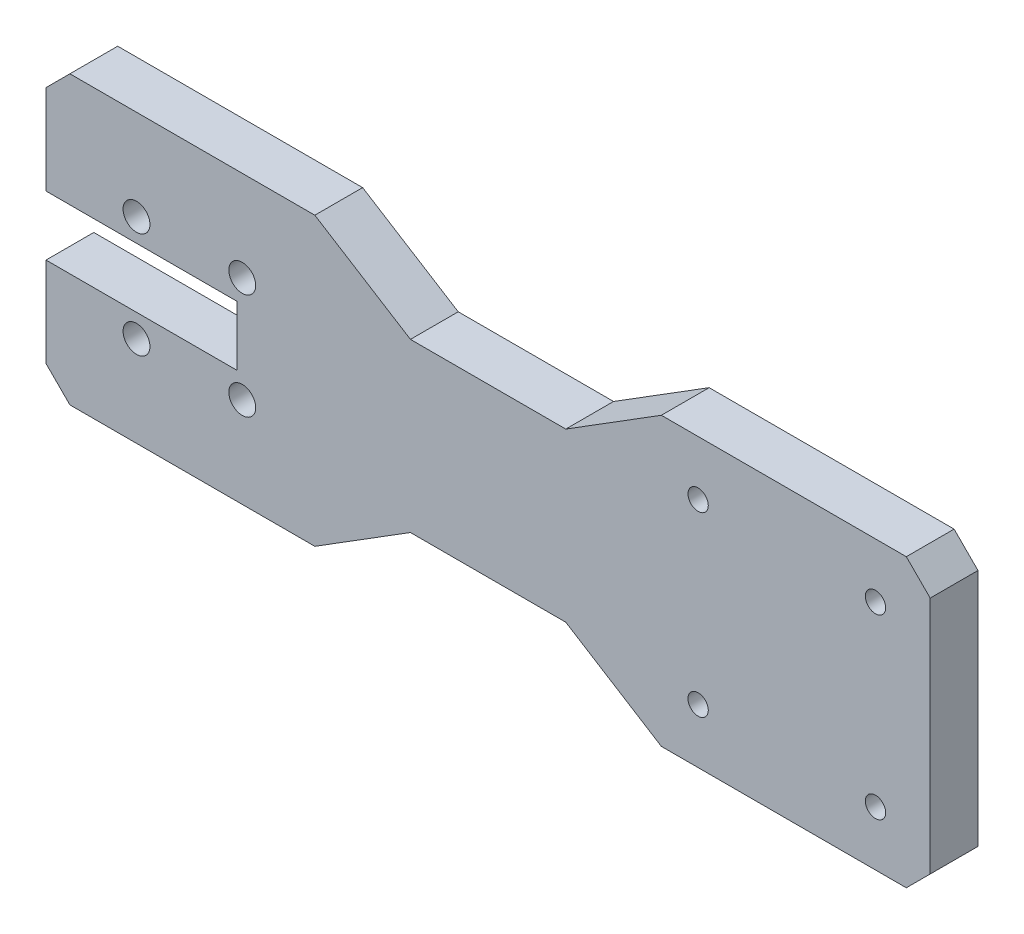
ISO-10303-21;
HEADER;
FILE_DESCRIPTION(('STEP AP214'),'2;1');
FILE_NAME('part.step','',(''),(''),'','','');
FILE_SCHEMA(('AUTOMOTIVE_DESIGN { 1 0 10303 214 1 1 1 1 }'));
ENDSEC;
DATA;
#1=APPLICATION_CONTEXT('core data for automotive mechanical design processes');
#2=APPLICATION_PROTOCOL_DEFINITION('international standard','automotive_design',2000,#1);
#3=PRODUCT_CONTEXT('',#1,'mechanical');
#4=PRODUCT('Part','Part','',(#3));
#5=PRODUCT_RELATED_PRODUCT_CATEGORY('part','',(#4));
#6=PRODUCT_DEFINITION_FORMATION('','',#4);
#7=PRODUCT_DEFINITION_CONTEXT('part definition',#1,'design');
#8=PRODUCT_DEFINITION('design','',#6,#7);
#9=PRODUCT_DEFINITION_SHAPE('','',#8);
#10=(LENGTH_UNIT() NAMED_UNIT(*) SI_UNIT(.MILLI.,.METRE.));
#11=(NAMED_UNIT(*) PLANE_ANGLE_UNIT() SI_UNIT($,.RADIAN.));
#12=(NAMED_UNIT(*) SI_UNIT($,.STERADIAN.) SOLID_ANGLE_UNIT());
#13=UNCERTAINTY_MEASURE_WITH_UNIT(LENGTH_MEASURE(1.E-05),#10,'distance_accuracy_value','');
#14=(GEOMETRIC_REPRESENTATION_CONTEXT(3) GLOBAL_UNCERTAINTY_ASSIGNED_CONTEXT((#13)) GLOBAL_UNIT_ASSIGNED_CONTEXT((#10,
#11,#12)) REPRESENTATION_CONTEXT('',''));
#15=CARTESIAN_POINT('',(0.,0.,0.));
#16=DIRECTION('',(0.,0.,1.));
#17=DIRECTION('',(1.,0.,0.));
#18=AXIS2_PLACEMENT_3D('',#15,#16,#17);
#19=CARTESIAN_POINT('',(0.,0.,8.));
#20=DIRECTION('',(0.,0.,1.));
#21=DIRECTION('',(1.,0.,0.));
#22=AXIS2_PLACEMENT_3D('',#19,#20,#21);
#23=PLANE('',#22);
#24=CARTESIAN_POINT('',(114.845,-14.845,8.));
#25=DIRECTION('',(0.,0.,1.));
#26=DIRECTION('',(1.,0.,0.));
#27=AXIS2_PLACEMENT_3D('',#24,#25,#26);
#28=CIRCLE('',#27,1.69999999999999);
#29=CARTESIAN_POINT('',(116.545,-14.845,8.));
#30=VERTEX_POINT('',#29);
#31=EDGE_CURVE('E415',#30,#30,#28,.T.);
#32=ORIENTED_EDGE('',*,*,#31,.F.);
#33=EDGE_LOOP('',(#32));
#34=FACE_BOUND('',#33,.T.);
#35=CARTESIAN_POINT('',(85.155,-14.845,8.));
#36=DIRECTION('',(0.,0.,1.));
#37=DIRECTION('',(1.,0.,0.));
#38=AXIS2_PLACEMENT_3D('',#35,#36,#37);
#39=CIRCLE('',#38,1.69999999999999);
#40=CARTESIAN_POINT('',(86.855,-14.845,8.));
#41=VERTEX_POINT('',#40);
#42=EDGE_CURVE('E427',#41,#41,#39,.T.);
#43=ORIENTED_EDGE('',*,*,#42,.F.);
#44=EDGE_LOOP('',(#43));
#45=FACE_BOUND('',#44,.T.);
#46=CARTESIAN_POINT('',(8.85,-8.85,8.));
#47=DIRECTION('',(0.,0.,1.));
#48=DIRECTION('',(1.,0.,0.));
#49=AXIS2_PLACEMENT_3D('',#46,#47,#48);
#50=CIRCLE('',#49,2.25);
#51=CARTESIAN_POINT('',(11.1,-8.85,8.));
#52=VERTEX_POINT('',#51);
#53=EDGE_CURVE('E439',#52,#52,#50,.T.);
#54=ORIENTED_EDGE('',*,*,#53,.F.);
#55=EDGE_LOOP('',(#54));
#56=FACE_BOUND('',#55,.T.);
#57=CARTESIAN_POINT('',(-8.85,-8.85,8.));
#58=DIRECTION('',(0.,0.,1.));
#59=DIRECTION('',(1.,0.,0.));
#60=AXIS2_PLACEMENT_3D('',#57,#58,#59);
#61=CIRCLE('',#60,2.25);
#62=CARTESIAN_POINT('',(-6.6,-8.85,8.));
#63=VERTEX_POINT('',#62);
#64=EDGE_CURVE('E210',#63,#63,#61,.T.);
#65=ORIENTED_EDGE('',*,*,#64,.F.);
#66=EDGE_LOOP('',(#65));
#67=FACE_BOUND('',#66,.T.);
#68=DIRECTION('',(0.,-1.,0.));
#69=VECTOR('',#68,1.);
#70=CARTESIAN_POINT('',(-24.,-5.,8.));
#71=LINE('',#70,#69);
#72=CARTESIAN_POINT('',(-24.,-5.,8.));
#73=VERTEX_POINT('',#72);
#74=CARTESIAN_POINT('',(-24.,-20.,8.));
#75=VERTEX_POINT('',#74);
#76=EDGE_CURVE('E245',#73,#75,#71,.T.);
#77=ORIENTED_EDGE('',*,*,#76,.T.);
#78=DIRECTION('',(0.707106781186548,-0.707106781186548,0.));
#79=VECTOR('',#78,1.);
#80=CARTESIAN_POINT('',(-24.,-20.,8.));
#81=LINE('',#80,#79);
#82=CARTESIAN_POINT('',(-20.,-24.,8.));
#83=VERTEX_POINT('',#82);
#84=EDGE_CURVE('E133',#75,#83,#81,.T.);
#85=ORIENTED_EDGE('',*,*,#84,.T.);
#86=DIRECTION('',(1.,0.,0.));
#87=VECTOR('',#86,1.);
#88=CARTESIAN_POINT('',(-20.,-24.,8.));
#89=LINE('',#88,#87);
#90=CARTESIAN_POINT('',(21.,-24.,8.));
#91=VERTEX_POINT('',#90);
#92=EDGE_CURVE('E296',#83,#91,#89,.T.);
#93=ORIENTED_EDGE('',*,*,#92,.T.);
#94=DIRECTION('',(0.847998304005088,0.52999894000318,0.));
#95=VECTOR('',#94,1.);
#96=CARTESIAN_POINT('',(21.,-24.,8.));
#97=LINE('',#96,#95);
#98=CARTESIAN_POINT('',(37.,-14.,8.));
#99=VERTEX_POINT('',#98);
#100=EDGE_CURVE('E315',#91,#99,#97,.T.);
#101=ORIENTED_EDGE('',*,*,#100,.T.);
#102=DIRECTION('',(1.,0.,0.));
#103=VECTOR('',#102,1.);
#104=CARTESIAN_POINT('',(37.,-14.,8.));
#105=LINE('',#104,#103);
#106=CARTESIAN_POINT('',(63.,-14.,8.));
#107=VERTEX_POINT('',#106);
#108=EDGE_CURVE('E312',#99,#107,#105,.T.);
#109=ORIENTED_EDGE('',*,*,#108,.T.);
#110=DIRECTION('',(0.847998304005088,-0.52999894000318,0.));
#111=VECTOR('',#110,1.);
#112=CARTESIAN_POINT('',(63.,-14.,8.));
#113=LINE('',#112,#111);
#114=CARTESIAN_POINT('',(79.,-24.,8.));
#115=VERTEX_POINT('',#114);
#116=EDGE_CURVE('E314',#107,#115,#113,.T.);
#117=ORIENTED_EDGE('',*,*,#116,.T.);
#118=DIRECTION('',(1.,0.,0.));
#119=VECTOR('',#118,1.);
#120=CARTESIAN_POINT('',(79.,-24.,8.));
#121=LINE('',#120,#119);
#122=CARTESIAN_POINT('',(120.,-24.,8.));
#123=VERTEX_POINT('',#122);
#124=EDGE_CURVE('E317',#115,#123,#121,.T.);
#125=ORIENTED_EDGE('',*,*,#124,.T.);
#126=DIRECTION('',(0.707106781186548,0.707106781186547,0.));
#127=VECTOR('',#126,1.);
#128=CARTESIAN_POINT('',(120.,-24.,8.));
#129=LINE('',#128,#127);
#130=CARTESIAN_POINT('',(124.,-20.,8.));
#131=VERTEX_POINT('',#130);
#132=EDGE_CURVE('E323',#123,#131,#129,.T.);
#133=ORIENTED_EDGE('',*,*,#132,.T.);
#134=DIRECTION('',(0.,1.,0.));
#135=VECTOR('',#134,1.);
#136=CARTESIAN_POINT('',(124.,-20.,8.));
#137=LINE('',#136,#135);
#138=CARTESIAN_POINT('',(124.,20.,8.));
#139=VERTEX_POINT('',#138);
#140=EDGE_CURVE('E325',#131,#139,#137,.T.);
#141=ORIENTED_EDGE('',*,*,#140,.T.);
#142=DIRECTION('',(-0.707106781186548,0.707106781186547,0.));
#143=VECTOR('',#142,1.);
#144=CARTESIAN_POINT('',(124.,20.,8.));
#145=LINE('',#144,#143);
#146=CARTESIAN_POINT('',(120.,24.,8.));
#147=VERTEX_POINT('',#146);
#148=EDGE_CURVE('E327',#139,#147,#145,.T.);
#149=ORIENTED_EDGE('',*,*,#148,.T.);
#150=DIRECTION('',(-1.,0.,0.));
#151=VECTOR('',#150,1.);
#152=CARTESIAN_POINT('',(120.,24.,8.));
#153=LINE('',#152,#151);
#154=CARTESIAN_POINT('',(79.,24.,8.));
#155=VERTEX_POINT('',#154);
#156=EDGE_CURVE('E329',#147,#155,#153,.T.);
#157=ORIENTED_EDGE('',*,*,#156,.T.);
#158=DIRECTION('',(-0.847998304005088,-0.52999894000318,0.));
#159=VECTOR('',#158,1.);
#160=CARTESIAN_POINT('',(79.,24.,8.));
#161=LINE('',#160,#159);
#162=CARTESIAN_POINT('',(63.,14.,8.));
#163=VERTEX_POINT('',#162);
#164=EDGE_CURVE('E331',#155,#163,#161,.T.);
#165=ORIENTED_EDGE('',*,*,#164,.T.);
#166=DIRECTION('',(-1.,0.,0.));
#167=VECTOR('',#166,1.);
#168=CARTESIAN_POINT('',(63.,14.,8.));
#169=LINE('',#168,#167);
#170=CARTESIAN_POINT('',(37.,14.,8.));
#171=VERTEX_POINT('',#170);
#172=EDGE_CURVE('E333',#163,#171,#169,.T.);
#173=ORIENTED_EDGE('',*,*,#172,.T.);
#174=DIRECTION('',(-0.847998304005088,0.52999894000318,0.));
#175=VECTOR('',#174,1.);
#176=CARTESIAN_POINT('',(37.,14.,8.));
#177=LINE('',#176,#175);
#178=CARTESIAN_POINT('',(21.,24.,8.));
#179=VERTEX_POINT('',#178);
#180=EDGE_CURVE('E335',#171,#179,#177,.T.);
#181=ORIENTED_EDGE('',*,*,#180,.T.);
#182=DIRECTION('',(-1.,0.,0.));
#183=VECTOR('',#182,1.);
#184=CARTESIAN_POINT('',(21.,24.,8.));
#185=LINE('',#184,#183);
#186=CARTESIAN_POINT('',(-20.,24.,8.));
#187=VERTEX_POINT('',#186);
#188=EDGE_CURVE('E337',#179,#187,#185,.T.);
#189=ORIENTED_EDGE('',*,*,#188,.T.);
#190=DIRECTION('',(-0.707106781186548,-0.707106781186548,0.));
#191=VECTOR('',#190,1.);
#192=CARTESIAN_POINT('',(-20.,24.,8.));
#193=LINE('',#192,#191);
#194=CARTESIAN_POINT('',(-24.,20.,8.));
#195=VERTEX_POINT('',#194);
#196=EDGE_CURVE('E339',#187,#195,#193,.T.);
#197=ORIENTED_EDGE('',*,*,#196,.T.);
#198=DIRECTION('',(0.,-1.,0.));
#199=VECTOR('',#198,1.);
#200=CARTESIAN_POINT('',(-24.,20.,8.));
#201=LINE('',#200,#199);
#202=CARTESIAN_POINT('',(-24.,5.,8.));
#203=VERTEX_POINT('',#202);
#204=EDGE_CURVE('E188',#195,#203,#201,.T.);
#205=ORIENTED_EDGE('',*,*,#204,.T.);
#206=DIRECTION('',(1.,0.,0.));
#207=VECTOR('',#206,1.);
#208=CARTESIAN_POINT('',(-24.,5.,8.));
#209=LINE('',#208,#207);
#210=CARTESIAN_POINT('',(8.,5.,8.));
#211=VERTEX_POINT('',#210);
#212=EDGE_CURVE('E182',#203,#211,#209,.T.);
#213=ORIENTED_EDGE('',*,*,#212,.T.);
#214=DIRECTION('',(0.,-1.,0.));
#215=VECTOR('',#214,1.);
#216=CARTESIAN_POINT('',(8.,5.,8.));
#217=LINE('',#216,#215);
#218=CARTESIAN_POINT('',(8.,-5.,8.));
#219=VERTEX_POINT('',#218);
#220=EDGE_CURVE('E186',#211,#219,#217,.T.);
#221=ORIENTED_EDGE('',*,*,#220,.T.);
#222=DIRECTION('',(-1.,0.,0.));
#223=VECTOR('',#222,1.);
#224=CARTESIAN_POINT('',(8.,-5.,8.));
#225=LINE('',#224,#223);
#226=EDGE_CURVE('E54',#219,#73,#225,.T.);
#227=ORIENTED_EDGE('',*,*,#226,.T.);
#228=EDGE_LOOP('',(#77,#85,#93,#101,#109,#117,#125,#133,#141,#149,#157,#165,#173,#181,#189,#197,
#205,#213,#221,#227));
#229=FACE_BOUND('',#228,.T.);
#230=CARTESIAN_POINT('',(-8.85,8.85,8.));
#231=DIRECTION('',(0.,0.,1.));
#232=DIRECTION('',(1.,0.,0.));
#233=AXIS2_PLACEMENT_3D('',#230,#231,#232);
#234=CIRCLE('',#233,2.25);
#235=CARTESIAN_POINT('',(-6.6,8.85,8.));
#236=VERTEX_POINT('',#235);
#237=EDGE_CURVE('E445',#236,#236,#234,.T.);
#238=ORIENTED_EDGE('',*,*,#237,.F.);
#239=EDGE_LOOP('',(#238));
#240=FACE_BOUND('',#239,.T.);
#241=CARTESIAN_POINT('',(8.85,8.85,8.));
#242=DIRECTION('',(0.,0.,1.));
#243=DIRECTION('',(1.,0.,0.));
#244=AXIS2_PLACEMENT_3D('',#241,#242,#243);
#245=CIRCLE('',#244,2.25);
#246=CARTESIAN_POINT('',(11.1,8.85,8.));
#247=VERTEX_POINT('',#246);
#248=EDGE_CURVE('E433',#247,#247,#245,.T.);
#249=ORIENTED_EDGE('',*,*,#248,.F.);
#250=EDGE_LOOP('',(#249));
#251=FACE_BOUND('',#250,.T.);
#252=CARTESIAN_POINT('',(85.155,14.845,8.));
#253=DIRECTION('',(0.,0.,1.));
#254=DIRECTION('',(1.,0.,0.));
#255=AXIS2_PLACEMENT_3D('',#252,#253,#254);
#256=CIRCLE('',#255,1.69999999999999);
#257=CARTESIAN_POINT('',(86.855,14.845,8.));
#258=VERTEX_POINT('',#257);
#259=EDGE_CURVE('E421',#258,#258,#256,.T.);
#260=ORIENTED_EDGE('',*,*,#259,.F.);
#261=EDGE_LOOP('',(#260));
#262=FACE_BOUND('',#261,.T.);
#263=CARTESIAN_POINT('',(114.845,14.845,8.));
#264=DIRECTION('',(0.,0.,1.));
#265=DIRECTION('',(1.,0.,0.));
#266=AXIS2_PLACEMENT_3D('',#263,#264,#265);
#267=CIRCLE('',#266,1.69999999999999);
#268=CARTESIAN_POINT('',(116.545,14.845,8.));
#269=VERTEX_POINT('',#268);
#270=EDGE_CURVE('E406',#269,#269,#267,.T.);
#271=ORIENTED_EDGE('',*,*,#270,.F.);
#272=EDGE_LOOP('',(#271));
#273=FACE_BOUND('',#272,.T.);
#274=ADVANCED_FACE('F37',(#34,#45,#56,#67,#229,#240,#251,#262,#273),#23,.T.);
#275=CARTESIAN_POINT('',(0.,0.,0.));
#276=DIRECTION('',(0.,0.,1.));
#277=DIRECTION('',(1.,0.,0.));
#278=AXIS2_PLACEMENT_3D('',#275,#276,#277);
#279=PLANE('',#278);
#280=DIRECTION('',(0.,-1.,0.));
#281=VECTOR('',#280,1.);
#282=CARTESIAN_POINT('',(-24.,-5.,0.));
#283=LINE('',#282,#281);
#284=CARTESIAN_POINT('',(-24.,-5.,0.));
#285=VERTEX_POINT('',#284);
#286=CARTESIAN_POINT('',(-24.,-20.,0.));
#287=VERTEX_POINT('',#286);
#288=EDGE_CURVE('E206',#285,#287,#283,.T.);
#289=ORIENTED_EDGE('',*,*,#288,.F.);
#290=DIRECTION('',(-1.,0.,0.));
#291=VECTOR('',#290,1.);
#292=CARTESIAN_POINT('',(8.,-5.,0.));
#293=LINE('',#292,#291);
#294=CARTESIAN_POINT('',(8.,-5.,0.));
#295=VERTEX_POINT('',#294);
#296=EDGE_CURVE('E125',#295,#285,#293,.T.);
#297=ORIENTED_EDGE('',*,*,#296,.F.);
#298=DIRECTION('',(0.,-1.,0.));
#299=VECTOR('',#298,1.);
#300=CARTESIAN_POINT('',(8.,5.,0.));
#301=LINE('',#300,#299);
#302=CARTESIAN_POINT('',(8.,5.,0.));
#303=VERTEX_POINT('',#302);
#304=EDGE_CURVE('E119',#303,#295,#301,.T.);
#305=ORIENTED_EDGE('',*,*,#304,.F.);
#306=DIRECTION('',(1.,0.,0.));
#307=VECTOR('',#306,1.);
#308=CARTESIAN_POINT('',(-24.,5.,0.));
#309=LINE('',#308,#307);
#310=CARTESIAN_POINT('',(-24.,5.,0.));
#311=VERTEX_POINT('',#310);
#312=EDGE_CURVE('E196',#311,#303,#309,.T.);
#313=ORIENTED_EDGE('',*,*,#312,.F.);
#314=DIRECTION('',(0.,-1.,0.));
#315=VECTOR('',#314,1.);
#316=CARTESIAN_POINT('',(-24.,20.,0.));
#317=LINE('',#316,#315);
#318=CARTESIAN_POINT('',(-24.,20.,0.));
#319=VERTEX_POINT('',#318);
#320=EDGE_CURVE('E240',#319,#311,#317,.T.);
#321=ORIENTED_EDGE('',*,*,#320,.F.);
#322=DIRECTION('',(-0.707106781186548,-0.707106781186548,0.));
#323=VECTOR('',#322,1.);
#324=CARTESIAN_POINT('',(-20.,24.,0.));
#325=LINE('',#324,#323);
#326=CARTESIAN_POINT('',(-20.,24.,0.));
#327=VERTEX_POINT('',#326);
#328=EDGE_CURVE('E238',#327,#319,#325,.T.);
#329=ORIENTED_EDGE('',*,*,#328,.F.);
#330=DIRECTION('',(-1.,0.,0.));
#331=VECTOR('',#330,1.);
#332=CARTESIAN_POINT('',(21.,24.,0.));
#333=LINE('',#332,#331);
#334=CARTESIAN_POINT('',(21.,24.,0.));
#335=VERTEX_POINT('',#334);
#336=EDGE_CURVE('E236',#335,#327,#333,.T.);
#337=ORIENTED_EDGE('',*,*,#336,.F.);
#338=DIRECTION('',(-0.847998304005088,0.52999894000318,0.));
#339=VECTOR('',#338,1.);
#340=CARTESIAN_POINT('',(37.,14.,0.));
#341=LINE('',#340,#339);
#342=CARTESIAN_POINT('',(37.,14.,0.));
#343=VERTEX_POINT('',#342);
#344=EDGE_CURVE('E234',#343,#335,#341,.T.);
#345=ORIENTED_EDGE('',*,*,#344,.F.);
#346=DIRECTION('',(-1.,0.,0.));
#347=VECTOR('',#346,1.);
#348=CARTESIAN_POINT('',(63.,14.,0.));
#349=LINE('',#348,#347);
#350=CARTESIAN_POINT('',(63.,14.,0.));
#351=VERTEX_POINT('',#350);
#352=EDGE_CURVE('E232',#351,#343,#349,.T.);
#353=ORIENTED_EDGE('',*,*,#352,.F.);
#354=DIRECTION('',(-0.847998304005088,-0.52999894000318,0.));
#355=VECTOR('',#354,1.);
#356=CARTESIAN_POINT('',(79.,24.,0.));
#357=LINE('',#356,#355);
#358=CARTESIAN_POINT('',(79.,24.,0.));
#359=VERTEX_POINT('',#358);
#360=EDGE_CURVE('E230',#359,#351,#357,.T.);
#361=ORIENTED_EDGE('',*,*,#360,.F.);
#362=DIRECTION('',(-1.,0.,0.));
#363=VECTOR('',#362,1.);
#364=CARTESIAN_POINT('',(120.,24.,0.));
#365=LINE('',#364,#363);
#366=CARTESIAN_POINT('',(120.,24.,0.));
#367=VERTEX_POINT('',#366);
#368=EDGE_CURVE('E228',#367,#359,#365,.T.);
#369=ORIENTED_EDGE('',*,*,#368,.F.);
#370=DIRECTION('',(-0.707106781186548,0.707106781186547,0.));
#371=VECTOR('',#370,1.);
#372=CARTESIAN_POINT('',(124.,20.,0.));
#373=LINE('',#372,#371);
#374=CARTESIAN_POINT('',(124.,20.,0.));
#375=VERTEX_POINT('',#374);
#376=EDGE_CURVE('E226',#375,#367,#373,.T.);
#377=ORIENTED_EDGE('',*,*,#376,.F.);
#378=DIRECTION('',(0.,1.,0.));
#379=VECTOR('',#378,1.);
#380=CARTESIAN_POINT('',(124.,-20.,0.));
#381=LINE('',#380,#379);
#382=CARTESIAN_POINT('',(124.,-20.,0.));
#383=VERTEX_POINT('',#382);
#384=EDGE_CURVE('E224',#383,#375,#381,.T.);
#385=ORIENTED_EDGE('',*,*,#384,.F.);
#386=DIRECTION('',(0.707106781186548,0.707106781186547,0.));
#387=VECTOR('',#386,1.);
#388=CARTESIAN_POINT('',(120.,-24.,0.));
#389=LINE('',#388,#387);
#390=CARTESIAN_POINT('',(120.,-24.,0.));
#391=VERTEX_POINT('',#390);
#392=EDGE_CURVE('E222',#391,#383,#389,.T.);
#393=ORIENTED_EDGE('',*,*,#392,.F.);
#394=DIRECTION('',(1.,0.,0.));
#395=VECTOR('',#394,1.);
#396=CARTESIAN_POINT('',(79.,-24.,0.));
#397=LINE('',#396,#395);
#398=CARTESIAN_POINT('',(79.,-24.,0.));
#399=VERTEX_POINT('',#398);
#400=EDGE_CURVE('E220',#399,#391,#397,.T.);
#401=ORIENTED_EDGE('',*,*,#400,.F.);
#402=DIRECTION('',(0.847998304005088,-0.52999894000318,0.));
#403=VECTOR('',#402,1.);
#404=CARTESIAN_POINT('',(63.,-14.,0.));
#405=LINE('',#404,#403);
#406=CARTESIAN_POINT('',(63.,-14.,0.));
#407=VERTEX_POINT('',#406);
#408=EDGE_CURVE('E218',#407,#399,#405,.T.);
#409=ORIENTED_EDGE('',*,*,#408,.F.);
#410=DIRECTION('',(1.,0.,0.));
#411=VECTOR('',#410,1.);
#412=CARTESIAN_POINT('',(37.,-14.,0.));
#413=LINE('',#412,#411);
#414=CARTESIAN_POINT('',(37.,-14.,0.));
#415=VERTEX_POINT('',#414);
#416=EDGE_CURVE('E216',#415,#407,#413,.T.);
#417=ORIENTED_EDGE('',*,*,#416,.F.);
#418=DIRECTION('',(0.847998304005088,0.52999894000318,0.));
#419=VECTOR('',#418,1.);
#420=CARTESIAN_POINT('',(21.,-24.,0.));
#421=LINE('',#420,#419);
#422=CARTESIAN_POINT('',(21.,-24.,0.));
#423=VERTEX_POINT('',#422);
#424=EDGE_CURVE('E214',#423,#415,#421,.T.);
#425=ORIENTED_EDGE('',*,*,#424,.F.);
#426=DIRECTION('',(1.,0.,0.));
#427=VECTOR('',#426,1.);
#428=CARTESIAN_POINT('',(-20.,-24.,0.));
#429=LINE('',#428,#427);
#430=CARTESIAN_POINT('',(-20.,-24.,0.));
#431=VERTEX_POINT('',#430);
#432=EDGE_CURVE('E212',#431,#423,#429,.T.);
#433=ORIENTED_EDGE('',*,*,#432,.F.);
#434=DIRECTION('',(0.707106781186548,-0.707106781186548,0.));
#435=VECTOR('',#434,1.);
#436=CARTESIAN_POINT('',(-24.,-20.,0.));
#437=LINE('',#436,#435);
#438=EDGE_CURVE('E209',#287,#431,#437,.T.);
#439=ORIENTED_EDGE('',*,*,#438,.F.);
#440=EDGE_LOOP('',(#289,#297,#305,#313,#321,#329,#337,#345,#353,#361,#369,#377,#385,#393,#401,
#409,#417,#425,#433,#439));
#441=FACE_BOUND('',#440,.T.);
#442=CARTESIAN_POINT('',(-8.85,-8.85,0.));
#443=DIRECTION('',(0.,0.,1.));
#444=DIRECTION('',(1.,0.,0.));
#445=AXIS2_PLACEMENT_3D('',#442,#443,#444);
#446=CIRCLE('',#445,2.25);
#447=CARTESIAN_POINT('',(-6.6,-8.85,0.));
#448=VERTEX_POINT('',#447);
#449=EDGE_CURVE('E448',#448,#448,#446,.T.);
#450=ORIENTED_EDGE('',*,*,#449,.T.);
#451=EDGE_LOOP('',(#450));
#452=FACE_BOUND('',#451,.T.);
#453=CARTESIAN_POINT('',(-8.85,8.85,0.));
#454=DIRECTION('',(0.,0.,1.));
#455=DIRECTION('',(1.,0.,0.));
#456=AXIS2_PLACEMENT_3D('',#453,#454,#455);
#457=CIRCLE('',#456,2.25);
#458=CARTESIAN_POINT('',(-6.6,8.85,0.));
#459=VERTEX_POINT('',#458);
#460=EDGE_CURVE('E442',#459,#459,#457,.T.);
#461=ORIENTED_EDGE('',*,*,#460,.T.);
#462=EDGE_LOOP('',(#461));
#463=FACE_BOUND('',#462,.T.);
#464=CARTESIAN_POINT('',(8.85,-8.85,0.));
#465=DIRECTION('',(0.,0.,1.));
#466=DIRECTION('',(1.,0.,0.));
#467=AXIS2_PLACEMENT_3D('',#464,#465,#466);
#468=CIRCLE('',#467,2.25);
#469=CARTESIAN_POINT('',(11.1,-8.85,0.));
#470=VERTEX_POINT('',#469);
#471=EDGE_CURVE('E436',#470,#470,#468,.T.);
#472=ORIENTED_EDGE('',*,*,#471,.T.);
#473=EDGE_LOOP('',(#472));
#474=FACE_BOUND('',#473,.T.);
#475=CARTESIAN_POINT('',(8.85,8.85,0.));
#476=DIRECTION('',(0.,0.,1.));
#477=DIRECTION('',(1.,0.,0.));
#478=AXIS2_PLACEMENT_3D('',#475,#476,#477);
#479=CIRCLE('',#478,2.25);
#480=CARTESIAN_POINT('',(11.1,8.85,0.));
#481=VERTEX_POINT('',#480);
#482=EDGE_CURVE('E430',#481,#481,#479,.T.);
#483=ORIENTED_EDGE('',*,*,#482,.T.);
#484=EDGE_LOOP('',(#483));
#485=FACE_BOUND('',#484,.T.);
#486=CARTESIAN_POINT('',(85.155,-14.845,0.));
#487=DIRECTION('',(0.,0.,1.));
#488=DIRECTION('',(1.,0.,0.));
#489=AXIS2_PLACEMENT_3D('',#486,#487,#488);
#490=CIRCLE('',#489,1.69999999999999);
#491=CARTESIAN_POINT('',(86.855,-14.845,0.));
#492=VERTEX_POINT('',#491);
#493=EDGE_CURVE('E424',#492,#492,#490,.T.);
#494=ORIENTED_EDGE('',*,*,#493,.T.);
#495=EDGE_LOOP('',(#494));
#496=FACE_BOUND('',#495,.T.);
#497=CARTESIAN_POINT('',(85.155,14.845,0.));
#498=DIRECTION('',(0.,0.,1.));
#499=DIRECTION('',(1.,0.,0.));
#500=AXIS2_PLACEMENT_3D('',#497,#498,#499);
#501=CIRCLE('',#500,1.69999999999999);
#502=CARTESIAN_POINT('',(86.855,14.845,0.));
#503=VERTEX_POINT('',#502);
#504=EDGE_CURVE('E418',#503,#503,#501,.T.);
#505=ORIENTED_EDGE('',*,*,#504,.T.);
#506=EDGE_LOOP('',(#505));
#507=FACE_BOUND('',#506,.T.);
#508=CARTESIAN_POINT('',(114.845,-14.845,0.));
#509=DIRECTION('',(0.,0.,1.));
#510=DIRECTION('',(1.,0.,0.));
#511=AXIS2_PLACEMENT_3D('',#508,#509,#510);
#512=CIRCLE('',#511,1.69999999999999);
#513=CARTESIAN_POINT('',(116.545,-14.845,0.));
#514=VERTEX_POINT('',#513);
#515=EDGE_CURVE('E412',#514,#514,#512,.T.);
#516=ORIENTED_EDGE('',*,*,#515,.T.);
#517=EDGE_LOOP('',(#516));
#518=FACE_BOUND('',#517,.T.);
#519=CARTESIAN_POINT('',(114.845,14.845,0.));
#520=DIRECTION('',(0.,0.,1.));
#521=DIRECTION('',(1.,0.,0.));
#522=AXIS2_PLACEMENT_3D('',#519,#520,#521);
#523=CIRCLE('',#522,1.69999999999999);
#524=CARTESIAN_POINT('',(116.545,14.845,0.));
#525=VERTEX_POINT('',#524);
#526=EDGE_CURVE('E409',#525,#525,#523,.T.);
#527=ORIENTED_EDGE('',*,*,#526,.T.);
#528=EDGE_LOOP('',(#527));
#529=FACE_BOUND('',#528,.T.);
#530=ADVANCED_FACE('F300',(#441,#452,#463,#474,#485,#496,#507,#518,#529),#279,.F.);
#531=CARTESIAN_POINT('',(-24.,-5.,8.));
#532=DIRECTION('',(1.,0.,0.));
#533=DIRECTION('',(0.,0.,-1.));
#534=AXIS2_PLACEMENT_3D('',#531,#532,#533);
#535=PLANE('',#534);
#536=ORIENTED_EDGE('',*,*,#288,.T.);
#537=DIRECTION('',(0.,0.,-1.));
#538=VECTOR('',#537,1.);
#539=CARTESIAN_POINT('',(-24.,-20.,8.));
#540=LINE('',#539,#538);
#541=EDGE_CURVE('E11',#75,#287,#540,.T.);
#542=ORIENTED_EDGE('',*,*,#541,.F.);
#543=ORIENTED_EDGE('',*,*,#76,.F.);
#544=DIRECTION('',(0.,0.,-1.));
#545=VECTOR('',#544,1.);
#546=CARTESIAN_POINT('',(-24.,-5.,8.));
#547=LINE('',#546,#545);
#548=EDGE_CURVE('E202',#73,#285,#547,.T.);
#549=ORIENTED_EDGE('',*,*,#548,.T.);
#550=EDGE_LOOP('',(#536,#542,#543,#549));
#551=FACE_BOUND('',#550,.T.);
#552=ADVANCED_FACE('F39',(#551),#535,.F.);
#553=CARTESIAN_POINT('',(-24.,-20.,8.));
#554=DIRECTION('',(0.707106781186547,0.707106781186547,0.));
#555=DIRECTION('',(-0.707106781186548,0.707106781186548,0.));
#556=AXIS2_PLACEMENT_3D('',#553,#554,#555);
#557=PLANE('',#556);
#558=ORIENTED_EDGE('',*,*,#438,.T.);
#559=DIRECTION('',(0.,0.,-1.));
#560=VECTOR('',#559,1.);
#561=CARTESIAN_POINT('',(-20.,-24.,8.));
#562=LINE('',#561,#560);
#563=EDGE_CURVE('E46',#83,#431,#562,.T.);
#564=ORIENTED_EDGE('',*,*,#563,.F.);
#565=ORIENTED_EDGE('',*,*,#84,.F.);
#566=ORIENTED_EDGE('',*,*,#541,.T.);
#567=EDGE_LOOP('',(#558,#564,#565,#566));
#568=FACE_BOUND('',#567,.T.);
#569=ADVANCED_FACE('F674',(#568),#557,.F.);
#570=CARTESIAN_POINT('',(-20.,-24.,8.));
#571=DIRECTION('',(0.,1.,0.));
#572=DIRECTION('',(0.,0.,1.));
#573=AXIS2_PLACEMENT_3D('',#570,#571,#572);
#574=PLANE('',#573);
#575=ORIENTED_EDGE('',*,*,#432,.T.);
#576=DIRECTION('',(0.,0.,-1.));
#577=VECTOR('',#576,1.);
#578=CARTESIAN_POINT('',(21.,-24.,8.));
#579=LINE('',#578,#577);
#580=EDGE_CURVE('E288',#91,#423,#579,.T.);
#581=ORIENTED_EDGE('',*,*,#580,.F.);
#582=ORIENTED_EDGE('',*,*,#92,.F.);
#583=ORIENTED_EDGE('',*,*,#563,.T.);
#584=EDGE_LOOP('',(#575,#581,#582,#583));
#585=FACE_BOUND('',#584,.T.);
#586=ADVANCED_FACE('F294',(#585),#574,.F.);
#587=CARTESIAN_POINT('',(21.,-24.,8.));
#588=DIRECTION('',(-0.52999894000318,0.847998304005088,0.));
#589=DIRECTION('',(-0.847998304005088,-0.52999894000318,0.));
#590=AXIS2_PLACEMENT_3D('',#587,#588,#589);
#591=PLANE('',#590);
#592=ORIENTED_EDGE('',*,*,#424,.T.);
#593=DIRECTION('',(0.,0.,-1.));
#594=VECTOR('',#593,1.);
#595=CARTESIAN_POINT('',(37.,-14.,8.));
#596=LINE('',#595,#594);
#597=EDGE_CURVE('E285',#99,#415,#596,.T.);
#598=ORIENTED_EDGE('',*,*,#597,.F.);
#599=ORIENTED_EDGE('',*,*,#100,.F.);
#600=ORIENTED_EDGE('',*,*,#580,.T.);
#601=EDGE_LOOP('',(#592,#598,#599,#600));
#602=FACE_BOUND('',#601,.T.);
#603=ADVANCED_FACE('F306',(#602),#591,.F.);
#604=CARTESIAN_POINT('',(37.,-14.,8.));
#605=DIRECTION('',(0.,1.,0.));
#606=DIRECTION('',(0.,0.,1.));
#607=AXIS2_PLACEMENT_3D('',#604,#605,#606);
#608=PLANE('',#607);
#609=ORIENTED_EDGE('',*,*,#416,.T.);
#610=DIRECTION('',(0.,0.,-1.));
#611=VECTOR('',#610,1.);
#612=CARTESIAN_POINT('',(63.,-14.,8.));
#613=LINE('',#612,#611);
#614=EDGE_CURVE('E282',#107,#407,#613,.T.);
#615=ORIENTED_EDGE('',*,*,#614,.F.);
#616=ORIENTED_EDGE('',*,*,#108,.F.);
#617=ORIENTED_EDGE('',*,*,#597,.T.);
#618=EDGE_LOOP('',(#609,#615,#616,#617));
#619=FACE_BOUND('',#618,.T.);
#620=ADVANCED_FACE('F310',(#619),#608,.F.);
#621=CARTESIAN_POINT('',(63.,-14.,8.));
#622=DIRECTION('',(0.52999894000318,0.847998304005088,0.));
#623=DIRECTION('',(-0.847998304005088,0.52999894000318,0.));
#624=AXIS2_PLACEMENT_3D('',#621,#622,#623);
#625=PLANE('',#624);
#626=ORIENTED_EDGE('',*,*,#408,.T.);
#627=DIRECTION('',(0.,0.,-1.));
#628=VECTOR('',#627,1.);
#629=CARTESIAN_POINT('',(79.,-24.,8.));
#630=LINE('',#629,#628);
#631=EDGE_CURVE('E279',#115,#399,#630,.T.);
#632=ORIENTED_EDGE('',*,*,#631,.F.);
#633=ORIENTED_EDGE('',*,*,#116,.F.);
#634=ORIENTED_EDGE('',*,*,#614,.T.);
#635=EDGE_LOOP('',(#626,#632,#633,#634));
#636=FACE_BOUND('',#635,.T.);
#637=ADVANCED_FACE('F639',(#636),#625,.F.);
#638=CARTESIAN_POINT('',(79.,-24.,8.));
#639=DIRECTION('',(0.,1.,0.));
#640=DIRECTION('',(0.,0.,1.));
#641=AXIS2_PLACEMENT_3D('',#638,#639,#640);
#642=PLANE('',#641);
#643=ORIENTED_EDGE('',*,*,#400,.T.);
#644=DIRECTION('',(0.,0.,-1.));
#645=VECTOR('',#644,1.);
#646=CARTESIAN_POINT('',(120.,-24.,8.));
#647=LINE('',#646,#645);
#648=EDGE_CURVE('E276',#123,#391,#647,.T.);
#649=ORIENTED_EDGE('',*,*,#648,.F.);
#650=ORIENTED_EDGE('',*,*,#124,.F.);
#651=ORIENTED_EDGE('',*,*,#631,.T.);
#652=EDGE_LOOP('',(#643,#649,#650,#651));
#653=FACE_BOUND('',#652,.T.);
#654=ADVANCED_FACE('F629',(#653),#642,.F.);
#655=CARTESIAN_POINT('',(120.,-24.,8.));
#656=DIRECTION('',(-0.707106781186547,0.707106781186548,0.));
#657=DIRECTION('',(-0.707106781186548,-0.707106781186547,0.));
#658=AXIS2_PLACEMENT_3D('',#655,#656,#657);
#659=PLANE('',#658);
#660=ORIENTED_EDGE('',*,*,#392,.T.);
#661=DIRECTION('',(0.,0.,-1.));
#662=VECTOR('',#661,1.);
#663=CARTESIAN_POINT('',(124.,-20.,8.));
#664=LINE('',#663,#662);
#665=EDGE_CURVE('E273',#131,#383,#664,.T.);
#666=ORIENTED_EDGE('',*,*,#665,.F.);
#667=ORIENTED_EDGE('',*,*,#132,.F.);
#668=ORIENTED_EDGE('',*,*,#648,.T.);
#669=EDGE_LOOP('',(#660,#666,#667,#668));
#670=FACE_BOUND('',#669,.T.);
#671=ADVANCED_FACE('F619',(#670),#659,.F.);
#672=CARTESIAN_POINT('',(124.,-20.,8.));
#673=DIRECTION('',(-1.,0.,0.));
#674=DIRECTION('',(0.,0.,1.));
#675=AXIS2_PLACEMENT_3D('',#672,#673,#674);
#676=PLANE('',#675);
#677=ORIENTED_EDGE('',*,*,#384,.T.);
#678=DIRECTION('',(0.,0.,-1.));
#679=VECTOR('',#678,1.);
#680=CARTESIAN_POINT('',(124.,20.,8.));
#681=LINE('',#680,#679);
#682=EDGE_CURVE('E270',#139,#375,#681,.T.);
#683=ORIENTED_EDGE('',*,*,#682,.F.);
#684=ORIENTED_EDGE('',*,*,#140,.F.);
#685=ORIENTED_EDGE('',*,*,#665,.T.);
#686=EDGE_LOOP('',(#677,#683,#684,#685));
#687=FACE_BOUND('',#686,.T.);
#688=ADVANCED_FACE('F609',(#687),#676,.F.);
#689=CARTESIAN_POINT('',(124.,20.,8.));
#690=DIRECTION('',(-0.707106781186547,-0.707106781186548,0.));
#691=DIRECTION('',(0.707106781186548,-0.707106781186547,0.));
#692=AXIS2_PLACEMENT_3D('',#689,#690,#691);
#693=PLANE('',#692);
#694=ORIENTED_EDGE('',*,*,#376,.T.);
#695=DIRECTION('',(0.,0.,-1.));
#696=VECTOR('',#695,1.);
#697=CARTESIAN_POINT('',(120.,24.,8.));
#698=LINE('',#697,#696);
#699=EDGE_CURVE('E267',#147,#367,#698,.T.);
#700=ORIENTED_EDGE('',*,*,#699,.F.);
#701=ORIENTED_EDGE('',*,*,#148,.F.);
#702=ORIENTED_EDGE('',*,*,#682,.T.);
#703=EDGE_LOOP('',(#694,#700,#701,#702));
#704=FACE_BOUND('',#703,.T.);
#705=ADVANCED_FACE('F599',(#704),#693,.F.);
#706=CARTESIAN_POINT('',(120.,24.,8.));
#707=DIRECTION('',(0.,-1.,0.));
#708=DIRECTION('',(0.,0.,-1.));
#709=AXIS2_PLACEMENT_3D('',#706,#707,#708);
#710=PLANE('',#709);
#711=ORIENTED_EDGE('',*,*,#368,.T.);
#712=DIRECTION('',(0.,0.,-1.));
#713=VECTOR('',#712,1.);
#714=CARTESIAN_POINT('',(79.,24.,8.));
#715=LINE('',#714,#713);
#716=EDGE_CURVE('E264',#155,#359,#715,.T.);
#717=ORIENTED_EDGE('',*,*,#716,.F.);
#718=ORIENTED_EDGE('',*,*,#156,.F.);
#719=ORIENTED_EDGE('',*,*,#699,.T.);
#720=EDGE_LOOP('',(#711,#717,#718,#719));
#721=FACE_BOUND('',#720,.T.);
#722=ADVANCED_FACE('F589',(#721),#710,.F.);
#723=CARTESIAN_POINT('',(79.,24.,8.));
#724=DIRECTION('',(0.52999894000318,-0.847998304005088,0.));
#725=DIRECTION('',(0.847998304005088,0.52999894000318,0.));
#726=AXIS2_PLACEMENT_3D('',#723,#724,#725);
#727=PLANE('',#726);
#728=ORIENTED_EDGE('',*,*,#360,.T.);
#729=DIRECTION('',(0.,0.,-1.));
#730=VECTOR('',#729,1.);
#731=CARTESIAN_POINT('',(63.,14.,8.));
#732=LINE('',#731,#730);
#733=EDGE_CURVE('E261',#163,#351,#732,.T.);
#734=ORIENTED_EDGE('',*,*,#733,.F.);
#735=ORIENTED_EDGE('',*,*,#164,.F.);
#736=ORIENTED_EDGE('',*,*,#716,.T.);
#737=EDGE_LOOP('',(#728,#734,#735,#736));
#738=FACE_BOUND('',#737,.T.);
#739=ADVANCED_FACE('F579',(#738),#727,.F.);
#740=CARTESIAN_POINT('',(63.,14.,8.));
#741=DIRECTION('',(0.,-1.,0.));
#742=DIRECTION('',(0.,0.,-1.));
#743=AXIS2_PLACEMENT_3D('',#740,#741,#742);
#744=PLANE('',#743);
#745=ORIENTED_EDGE('',*,*,#352,.T.);
#746=DIRECTION('',(0.,0.,-1.));
#747=VECTOR('',#746,1.);
#748=CARTESIAN_POINT('',(37.,14.,8.));
#749=LINE('',#748,#747);
#750=EDGE_CURVE('E258',#171,#343,#749,.T.);
#751=ORIENTED_EDGE('',*,*,#750,.F.);
#752=ORIENTED_EDGE('',*,*,#172,.F.);
#753=ORIENTED_EDGE('',*,*,#733,.T.);
#754=EDGE_LOOP('',(#745,#751,#752,#753));
#755=FACE_BOUND('',#754,.T.);
#756=ADVANCED_FACE('F569',(#755),#744,.F.);
#757=CARTESIAN_POINT('',(37.,14.,8.));
#758=DIRECTION('',(-0.52999894000318,-0.847998304005088,0.));
#759=DIRECTION('',(0.847998304005088,-0.52999894000318,0.));
#760=AXIS2_PLACEMENT_3D('',#757,#758,#759);
#761=PLANE('',#760);
#762=ORIENTED_EDGE('',*,*,#344,.T.);
#763=DIRECTION('',(0.,0.,-1.));
#764=VECTOR('',#763,1.);
#765=CARTESIAN_POINT('',(21.,24.,8.));
#766=LINE('',#765,#764);
#767=EDGE_CURVE('E255',#179,#335,#766,.T.);
#768=ORIENTED_EDGE('',*,*,#767,.F.);
#769=ORIENTED_EDGE('',*,*,#180,.F.);
#770=ORIENTED_EDGE('',*,*,#750,.T.);
#771=EDGE_LOOP('',(#762,#768,#769,#770));
#772=FACE_BOUND('',#771,.T.);
#773=ADVANCED_FACE('F559',(#772),#761,.F.);
#774=CARTESIAN_POINT('',(21.,24.,8.));
#775=DIRECTION('',(0.,-1.,0.));
#776=DIRECTION('',(0.,0.,-1.));
#777=AXIS2_PLACEMENT_3D('',#774,#775,#776);
#778=PLANE('',#777);
#779=ORIENTED_EDGE('',*,*,#336,.T.);
#780=DIRECTION('',(0.,0.,-1.));
#781=VECTOR('',#780,1.);
#782=CARTESIAN_POINT('',(-20.,24.,8.));
#783=LINE('',#782,#781);
#784=EDGE_CURVE('E252',#187,#327,#783,.T.);
#785=ORIENTED_EDGE('',*,*,#784,.F.);
#786=ORIENTED_EDGE('',*,*,#188,.F.);
#787=ORIENTED_EDGE('',*,*,#767,.T.);
#788=EDGE_LOOP('',(#779,#785,#786,#787));
#789=FACE_BOUND('',#788,.T.);
#790=ADVANCED_FACE('F550',(#789),#778,.F.);
#791=CARTESIAN_POINT('',(-20.,24.,8.));
#792=DIRECTION('',(0.707106781186547,-0.707106781186547,0.));
#793=DIRECTION('',(0.707106781186548,0.707106781186548,0.));
#794=AXIS2_PLACEMENT_3D('',#791,#792,#793);
#795=PLANE('',#794);
#796=ORIENTED_EDGE('',*,*,#328,.T.);
#797=DIRECTION('',(0.,0.,-1.));
#798=VECTOR('',#797,1.);
#799=CARTESIAN_POINT('',(-24.,20.,8.));
#800=LINE('',#799,#798);
#801=EDGE_CURVE('E249',#195,#319,#800,.T.);
#802=ORIENTED_EDGE('',*,*,#801,.F.);
#803=ORIENTED_EDGE('',*,*,#196,.F.);
#804=ORIENTED_EDGE('',*,*,#784,.T.);
#805=EDGE_LOOP('',(#796,#802,#803,#804));
#806=FACE_BOUND('',#805,.T.);
#807=ADVANCED_FACE('F345',(#806),#795,.F.);
#808=CARTESIAN_POINT('',(-24.,20.,8.));
#809=DIRECTION('',(1.,0.,0.));
#810=DIRECTION('',(0.,0.,-1.));
#811=AXIS2_PLACEMENT_3D('',#808,#809,#810);
#812=PLANE('',#811);
#813=ORIENTED_EDGE('',*,*,#320,.T.);
#814=DIRECTION('',(0.,0.,-1.));
#815=VECTOR('',#814,1.);
#816=CARTESIAN_POINT('',(-24.,5.,8.));
#817=LINE('',#816,#815);
#818=EDGE_CURVE('E197',#203,#311,#817,.T.);
#819=ORIENTED_EDGE('',*,*,#818,.F.);
#820=ORIENTED_EDGE('',*,*,#204,.F.);
#821=ORIENTED_EDGE('',*,*,#801,.T.);
#822=EDGE_LOOP('',(#813,#819,#820,#821));
#823=FACE_BOUND('',#822,.T.);
#824=ADVANCED_FACE('F349',(#823),#812,.F.);
#825=CARTESIAN_POINT('',(-24.,5.,8.));
#826=DIRECTION('',(0.,1.,0.));
#827=DIRECTION('',(0.,0.,1.));
#828=AXIS2_PLACEMENT_3D('',#825,#826,#827);
#829=PLANE('',#828);
#830=ORIENTED_EDGE('',*,*,#312,.T.);
#831=DIRECTION('',(0.,0.,-1.));
#832=VECTOR('',#831,1.);
#833=CARTESIAN_POINT('',(8.,5.,8.));
#834=LINE('',#833,#832);
#835=EDGE_CURVE('E193',#211,#303,#834,.T.);
#836=ORIENTED_EDGE('',*,*,#835,.F.);
#837=ORIENTED_EDGE('',*,*,#212,.F.);
#838=ORIENTED_EDGE('',*,*,#818,.T.);
#839=EDGE_LOOP('',(#830,#836,#837,#838));
#840=FACE_BOUND('',#839,.T.);
#841=ADVANCED_FACE('F194',(#840),#829,.F.);
#842=CARTESIAN_POINT('',(8.,5.,8.));
#843=DIRECTION('',(1.,0.,0.));
#844=DIRECTION('',(0.,0.,-1.));
#845=AXIS2_PLACEMENT_3D('',#842,#843,#844);
#846=PLANE('',#845);
#847=ORIENTED_EDGE('',*,*,#304,.T.);
#848=DIRECTION('',(0.,0.,-1.));
#849=VECTOR('',#848,1.);
#850=CARTESIAN_POINT('',(8.,-5.,8.));
#851=LINE('',#850,#849);
#852=EDGE_CURVE('E198',#219,#295,#851,.T.);
#853=ORIENTED_EDGE('',*,*,#852,.F.);
#854=ORIENTED_EDGE('',*,*,#220,.F.);
#855=ORIENTED_EDGE('',*,*,#835,.T.);
#856=EDGE_LOOP('',(#847,#853,#854,#855));
#857=FACE_BOUND('',#856,.T.);
#858=ADVANCED_FACE('F200',(#857),#846,.F.);
#859=CARTESIAN_POINT('',(8.,-5.,8.));
#860=DIRECTION('',(0.,-1.,0.));
#861=DIRECTION('',(0.,0.,-1.));
#862=AXIS2_PLACEMENT_3D('',#859,#860,#861);
#863=PLANE('',#862);
#864=ORIENTED_EDGE('',*,*,#296,.T.);
#865=ORIENTED_EDGE('',*,*,#548,.F.);
#866=ORIENTED_EDGE('',*,*,#226,.F.);
#867=ORIENTED_EDGE('',*,*,#852,.T.);
#868=EDGE_LOOP('',(#864,#865,#866,#867));
#869=FACE_BOUND('',#868,.T.);
#870=ADVANCED_FACE('F353',(#869),#863,.F.);
#871=CARTESIAN_POINT('',(-8.85,-8.85,8.));
#872=DIRECTION('',(0.,0.,-1.));
#873=DIRECTION('',(-1.,0.,0.));
#874=AXIS2_PLACEMENT_3D('',#871,#872,#873);
#875=CYLINDRICAL_SURFACE('',#874,2.25);
#876=ORIENTED_EDGE('',*,*,#64,.T.);
#877=EDGE_LOOP('',(#876));
#878=FACE_BOUND('',#877,.T.);
#879=ORIENTED_EDGE('',*,*,#449,.F.);
#880=EDGE_LOOP('',(#879));
#881=FACE_BOUND('',#880,.T.);
#882=ADVANCED_FACE('F355',(#878,#881),#875,.F.);
#883=CARTESIAN_POINT('',(-8.85,8.85,8.));
#884=DIRECTION('',(0.,0.,-1.));
#885=DIRECTION('',(-1.,0.,0.));
#886=AXIS2_PLACEMENT_3D('',#883,#884,#885);
#887=CYLINDRICAL_SURFACE('',#886,2.25);
#888=ORIENTED_EDGE('',*,*,#237,.T.);
#889=EDGE_LOOP('',(#888));
#890=FACE_BOUND('',#889,.T.);
#891=ORIENTED_EDGE('',*,*,#460,.F.);
#892=EDGE_LOOP('',(#891));
#893=FACE_BOUND('',#892,.T.);
#894=ADVANCED_FACE('F361',(#890,#893),#887,.F.);
#895=CARTESIAN_POINT('',(8.85,-8.85,8.));
#896=DIRECTION('',(0.,0.,-1.));
#897=DIRECTION('',(-1.,0.,0.));
#898=AXIS2_PLACEMENT_3D('',#895,#896,#897);
#899=CYLINDRICAL_SURFACE('',#898,2.25);
#900=ORIENTED_EDGE('',*,*,#53,.T.);
#901=EDGE_LOOP('',(#900));
#902=FACE_BOUND('',#901,.T.);
#903=ORIENTED_EDGE('',*,*,#471,.F.);
#904=EDGE_LOOP('',(#903));
#905=FACE_BOUND('',#904,.T.);
#906=ADVANCED_FACE('F377',(#902,#905),#899,.F.);
#907=CARTESIAN_POINT('',(8.85,8.85,8.));
#908=DIRECTION('',(0.,0.,-1.));
#909=DIRECTION('',(-1.,0.,0.));
#910=AXIS2_PLACEMENT_3D('',#907,#908,#909);
#911=CYLINDRICAL_SURFACE('',#910,2.25);
#912=ORIENTED_EDGE('',*,*,#248,.T.);
#913=EDGE_LOOP('',(#912));
#914=FACE_BOUND('',#913,.T.);
#915=ORIENTED_EDGE('',*,*,#482,.F.);
#916=EDGE_LOOP('',(#915));
#917=FACE_BOUND('',#916,.T.);
#918=ADVANCED_FACE('F381',(#914,#917),#911,.F.);
#919=CARTESIAN_POINT('',(85.155,-14.845,8.));
#920=DIRECTION('',(0.,0.,-1.));
#921=DIRECTION('',(-1.,0.,0.));
#922=AXIS2_PLACEMENT_3D('',#919,#920,#921);
#923=CYLINDRICAL_SURFACE('',#922,1.69999999999999);
#924=ORIENTED_EDGE('',*,*,#42,.T.);
#925=EDGE_LOOP('',(#924));
#926=FACE_BOUND('',#925,.T.);
#927=ORIENTED_EDGE('',*,*,#493,.F.);
#928=EDGE_LOOP('',(#927));
#929=FACE_BOUND('',#928,.T.);
#930=ADVANCED_FACE('F385',(#926,#929),#923,.F.);
#931=CARTESIAN_POINT('',(85.155,14.845,8.));
#932=DIRECTION('',(0.,0.,-1.));
#933=DIRECTION('',(-1.,0.,0.));
#934=AXIS2_PLACEMENT_3D('',#931,#932,#933);
#935=CYLINDRICAL_SURFACE('',#934,1.69999999999999);
#936=ORIENTED_EDGE('',*,*,#259,.T.);
#937=EDGE_LOOP('',(#936));
#938=FACE_BOUND('',#937,.T.);
#939=ORIENTED_EDGE('',*,*,#504,.F.);
#940=EDGE_LOOP('',(#939));
#941=FACE_BOUND('',#940,.T.);
#942=ADVANCED_FACE('F389',(#938,#941),#935,.F.);
#943=CARTESIAN_POINT('',(114.845,-14.845,8.));
#944=DIRECTION('',(0.,0.,-1.));
#945=DIRECTION('',(-1.,0.,0.));
#946=AXIS2_PLACEMENT_3D('',#943,#944,#945);
#947=CYLINDRICAL_SURFACE('',#946,1.69999999999999);
#948=ORIENTED_EDGE('',*,*,#31,.T.);
#949=EDGE_LOOP('',(#948));
#950=FACE_BOUND('',#949,.T.);
#951=ORIENTED_EDGE('',*,*,#515,.F.);
#952=EDGE_LOOP('',(#951));
#953=FACE_BOUND('',#952,.T.);
#954=ADVANCED_FACE('F393',(#950,#953),#947,.F.);
#955=CARTESIAN_POINT('',(114.845,14.845,8.));
#956=DIRECTION('',(0.,0.,-1.));
#957=DIRECTION('',(-1.,0.,0.));
#958=AXIS2_PLACEMENT_3D('',#955,#956,#957);
#959=CYLINDRICAL_SURFACE('',#958,1.69999999999999);
#960=ORIENTED_EDGE('',*,*,#270,.T.);
#961=EDGE_LOOP('',(#960));
#962=FACE_BOUND('',#961,.T.);
#963=ORIENTED_EDGE('',*,*,#526,.F.);
#964=EDGE_LOOP('',(#963));
#965=FACE_BOUND('',#964,.T.);
#966=ADVANCED_FACE('F397',(#962,#965),#959,.F.);
#967=CLOSED_SHELL('',(#274,#530,#552,#569,#586,#603,#620,#637,#654,#671,#688,#705,#722,#739,
#756,#773,#790,#807,#824,#841,#858,#870,#882,#894,#906,#918,#930,#942,#954,#966));
#968=MANIFOLD_SOLID_BREP('B2',#967);
#969=ADVANCED_BREP_SHAPE_REPRESENTATION('',(#18,#968),#14);
#970=SHAPE_DEFINITION_REPRESENTATION(#9,#969);
ENDSEC;
END-ISO-10303-21;
